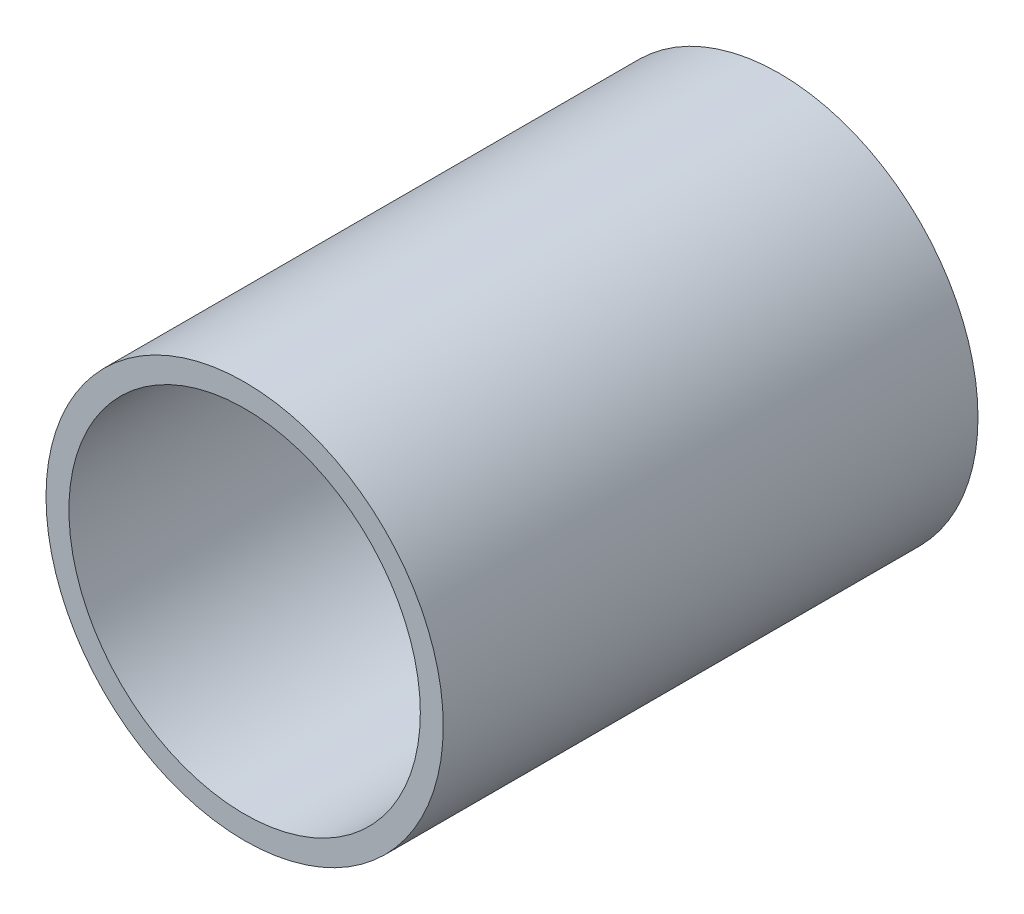
ISO-10303-21;
HEADER;
FILE_DESCRIPTION(('STEP AP214'),'2;1');
FILE_NAME('part.step','',(''),(''),'','','');
FILE_SCHEMA(('AUTOMOTIVE_DESIGN { 1 0 10303 214 1 1 1 1 }'));
ENDSEC;
DATA;
#1=APPLICATION_CONTEXT('core data for automotive mechanical design processes');
#2=APPLICATION_PROTOCOL_DEFINITION('international standard','automotive_design',2000,#1);
#3=PRODUCT_CONTEXT('',#1,'mechanical');
#4=PRODUCT('Part','Part','',(#3));
#5=PRODUCT_RELATED_PRODUCT_CATEGORY('part','',(#4));
#6=PRODUCT_DEFINITION_FORMATION('','',#4);
#7=PRODUCT_DEFINITION_CONTEXT('part definition',#1,'design');
#8=PRODUCT_DEFINITION('design','',#6,#7);
#9=PRODUCT_DEFINITION_SHAPE('','',#8);
#10=(LENGTH_UNIT() NAMED_UNIT(*) SI_UNIT(.MILLI.,.METRE.));
#11=(NAMED_UNIT(*) PLANE_ANGLE_UNIT() SI_UNIT($,.RADIAN.));
#12=(NAMED_UNIT(*) SI_UNIT($,.STERADIAN.) SOLID_ANGLE_UNIT());
#13=UNCERTAINTY_MEASURE_WITH_UNIT(LENGTH_MEASURE(1.E-05),#10,'distance_accuracy_value','');
#14=(GEOMETRIC_REPRESENTATION_CONTEXT(3) GLOBAL_UNCERTAINTY_ASSIGNED_CONTEXT((#13)) GLOBAL_UNIT_ASSIGNED_CONTEXT((#10,
#11,#12)) REPRESENTATION_CONTEXT('',''));
#15=CARTESIAN_POINT('',(0.,0.,0.));
#16=DIRECTION('',(0.,0.,1.));
#17=DIRECTION('',(1.,0.,0.));
#18=AXIS2_PLACEMENT_3D('',#15,#16,#17);
#19=CARTESIAN_POINT('',(0.,0.,35.));
#20=DIRECTION('',(0.,0.,1.));
#21=DIRECTION('',(1.,0.,0.));
#22=AXIS2_PLACEMENT_3D('',#19,#20,#21);
#23=PLANE('',#22);
#24=CARTESIAN_POINT('',(0.,0.,35.));
#25=DIRECTION('',(0.,0.,1.));
#26=DIRECTION('',(1.,0.,0.));
#27=AXIS2_PLACEMENT_3D('',#24,#25,#26);
#28=CIRCLE('',#27,26.);
#29=CARTESIAN_POINT('',(26.,0.,35.));
#30=VERTEX_POINT('',#29);
#31=EDGE_CURVE('E10',#30,#30,#28,.T.);
#32=ORIENTED_EDGE('',*,*,#31,.T.);
#33=EDGE_LOOP('',(#32));
#34=FACE_BOUND('',#33,.T.);
#35=CARTESIAN_POINT('',(0.,0.,35.));
#36=DIRECTION('',(0.,0.,1.));
#37=DIRECTION('',(1.,0.,0.));
#38=AXIS2_PLACEMENT_3D('',#35,#36,#37);
#39=CIRCLE('',#38,23.);
#40=CARTESIAN_POINT('',(23.,0.,35.));
#41=VERTEX_POINT('',#40);
#42=EDGE_CURVE('E50',#41,#41,#39,.T.);
#43=ORIENTED_EDGE('',*,*,#42,.F.);
#44=EDGE_LOOP('',(#43));
#45=FACE_BOUND('',#44,.T.);
#46=ADVANCED_FACE('F37',(#34,#45),#23,.T.);
#47=CARTESIAN_POINT('',(0.,0.,-35.));
#48=DIRECTION('',(0.,0.,1.));
#49=DIRECTION('',(1.,0.,0.));
#50=AXIS2_PLACEMENT_3D('',#47,#48,#49);
#51=PLANE('',#50);
#52=CARTESIAN_POINT('',(0.,0.,-35.));
#53=DIRECTION('',(0.,0.,1.));
#54=DIRECTION('',(1.,0.,0.));
#55=AXIS2_PLACEMENT_3D('',#52,#53,#54);
#56=CIRCLE('',#55,26.);
#57=CARTESIAN_POINT('',(26.,0.,-35.));
#58=VERTEX_POINT('',#57);
#59=EDGE_CURVE('E41',#58,#58,#56,.T.);
#60=ORIENTED_EDGE('',*,*,#59,.F.);
#61=EDGE_LOOP('',(#60));
#62=FACE_BOUND('',#61,.T.);
#63=CARTESIAN_POINT('',(0.,0.,-35.));
#64=DIRECTION('',(0.,0.,1.));
#65=DIRECTION('',(1.,0.,0.));
#66=AXIS2_PLACEMENT_3D('',#63,#64,#65);
#67=CIRCLE('',#66,23.);
#68=CARTESIAN_POINT('',(23.,0.,-35.));
#69=VERTEX_POINT('',#68);
#70=EDGE_CURVE('E52',#69,#69,#67,.T.);
#71=ORIENTED_EDGE('',*,*,#70,.T.);
#72=EDGE_LOOP('',(#71));
#73=FACE_BOUND('',#72,.T.);
#74=ADVANCED_FACE('F64',(#62,#73),#51,.F.);
#75=CARTESIAN_POINT('',(0.,0.,35.));
#76=DIRECTION('',(0.,0.,-1.));
#77=DIRECTION('',(-1.,0.,0.));
#78=AXIS2_PLACEMENT_3D('',#75,#76,#77);
#79=CYLINDRICAL_SURFACE('',#78,26.);
#80=ORIENTED_EDGE('',*,*,#31,.F.);
#81=EDGE_LOOP('',(#80));
#82=FACE_BOUND('',#81,.T.);
#83=ORIENTED_EDGE('',*,*,#59,.T.);
#84=EDGE_LOOP('',(#83));
#85=FACE_BOUND('',#84,.T.);
#86=ADVANCED_FACE('F39',(#82,#85),#79,.T.);
#87=CARTESIAN_POINT('',(0.,0.,35.));
#88=DIRECTION('',(0.,0.,-1.));
#89=DIRECTION('',(-1.,0.,0.));
#90=AXIS2_PLACEMENT_3D('',#87,#88,#89);
#91=CYLINDRICAL_SURFACE('',#90,23.);
#92=ORIENTED_EDGE('',*,*,#42,.T.);
#93=EDGE_LOOP('',(#92));
#94=FACE_BOUND('',#93,.T.);
#95=ORIENTED_EDGE('',*,*,#70,.F.);
#96=EDGE_LOOP('',(#95));
#97=FACE_BOUND('',#96,.T.);
#98=ADVANCED_FACE('F60',(#94,#97),#91,.F.);
#99=CLOSED_SHELL('',(#46,#74,#86,#98));
#100=MANIFOLD_SOLID_BREP('B2',#99);
#101=ADVANCED_BREP_SHAPE_REPRESENTATION('',(#18,#100),#14);
#102=SHAPE_DEFINITION_REPRESENTATION(#9,#101);
ENDSEC;
END-ISO-10303-21;
